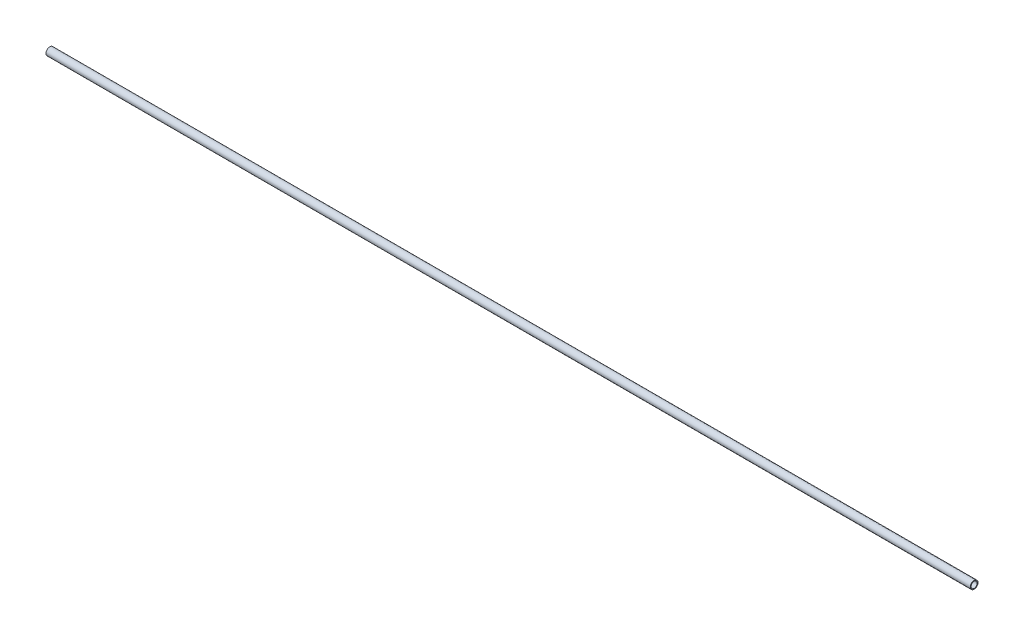
ISO-10303-21;
HEADER;
FILE_DESCRIPTION(('STEP AP214'),'2;1');
FILE_NAME('part.step','',(''),(''),'','','');
FILE_SCHEMA(('AUTOMOTIVE_DESIGN { 1 0 10303 214 1 1 1 1 }'));
ENDSEC;
DATA;
#1=APPLICATION_CONTEXT('core data for automotive mechanical design processes');
#2=APPLICATION_PROTOCOL_DEFINITION('international standard','automotive_design',2000,#1);
#3=PRODUCT_CONTEXT('',#1,'mechanical');
#4=PRODUCT('Part','Part','',(#3));
#5=PRODUCT_RELATED_PRODUCT_CATEGORY('part','',(#4));
#6=PRODUCT_DEFINITION_FORMATION('','',#4);
#7=PRODUCT_DEFINITION_CONTEXT('part definition',#1,'design');
#8=PRODUCT_DEFINITION('design','',#6,#7);
#9=PRODUCT_DEFINITION_SHAPE('','',#8);
#10=(LENGTH_UNIT() NAMED_UNIT(*) SI_UNIT(.MILLI.,.METRE.));
#11=(NAMED_UNIT(*) PLANE_ANGLE_UNIT() SI_UNIT($,.RADIAN.));
#12=(NAMED_UNIT(*) SI_UNIT($,.STERADIAN.) SOLID_ANGLE_UNIT());
#13=UNCERTAINTY_MEASURE_WITH_UNIT(LENGTH_MEASURE(1.E-05),#10,'distance_accuracy_value','');
#14=(GEOMETRIC_REPRESENTATION_CONTEXT(3) GLOBAL_UNCERTAINTY_ASSIGNED_CONTEXT((#13)) GLOBAL_UNIT_ASSIGNED_CONTEXT((#10,
#11,#12)) REPRESENTATION_CONTEXT('',''));
#15=CARTESIAN_POINT('',(0.,0.,0.));
#16=DIRECTION('',(0.,0.,1.));
#17=DIRECTION('',(1.,0.,0.));
#18=AXIS2_PLACEMENT_3D('',#15,#16,#17);
#19=CARTESIAN_POINT('',(1524.,0.,0.));
#20=DIRECTION('',(1.,0.,0.));
#21=DIRECTION('',(0.,0.,-1.));
#22=AXIS2_PLACEMENT_3D('',#19,#20,#21);
#23=PLANE('',#22);
#24=CARTESIAN_POINT('',(1524.,0.,0.));
#25=DIRECTION('',(1.,0.,0.));
#26=DIRECTION('',(0.,0.,-1.));
#27=AXIS2_PLACEMENT_3D('',#24,#25,#26);
#28=CIRCLE('',#27,6.35);
#29=CARTESIAN_POINT('',(1524.,0.,-6.35));
#30=VERTEX_POINT('',#29);
#31=EDGE_CURVE('E10',#30,#30,#28,.T.);
#32=ORIENTED_EDGE('',*,*,#31,.T.);
#33=EDGE_LOOP('',(#32));
#34=FACE_BOUND('',#33,.T.);
#35=CARTESIAN_POINT('',(1524.,0.,0.));
#36=DIRECTION('',(1.,0.,0.));
#37=DIRECTION('',(0.,0.,-1.));
#38=AXIS2_PLACEMENT_3D('',#35,#36,#37);
#39=CIRCLE('',#38,5.08);
#40=CARTESIAN_POINT('',(1524.,0.,-5.08));
#41=VERTEX_POINT('',#40);
#42=EDGE_CURVE('E45',#41,#41,#39,.T.);
#43=ORIENTED_EDGE('',*,*,#42,.F.);
#44=EDGE_LOOP('',(#43));
#45=FACE_BOUND('',#44,.T.);
#46=ADVANCED_FACE('F34',(#34,#45),#23,.T.);
#47=CARTESIAN_POINT('',(0.,0.,0.));
#48=DIRECTION('',(1.,0.,0.));
#49=DIRECTION('',(0.,0.,-1.));
#50=AXIS2_PLACEMENT_3D('',#47,#48,#49);
#51=PLANE('',#50);
#52=CARTESIAN_POINT('',(0.,0.,0.));
#53=DIRECTION('',(1.,0.,0.));
#54=DIRECTION('',(0.,0.,-1.));
#55=AXIS2_PLACEMENT_3D('',#52,#53,#54);
#56=CIRCLE('',#55,6.35);
#57=CARTESIAN_POINT('',(0.,0.,-6.35));
#58=VERTEX_POINT('',#57);
#59=EDGE_CURVE('E38',#58,#58,#56,.T.);
#60=ORIENTED_EDGE('',*,*,#59,.F.);
#61=EDGE_LOOP('',(#60));
#62=FACE_BOUND('',#61,.T.);
#63=CARTESIAN_POINT('',(0.,0.,0.));
#64=DIRECTION('',(1.,0.,0.));
#65=DIRECTION('',(0.,0.,-1.));
#66=AXIS2_PLACEMENT_3D('',#63,#64,#65);
#67=CIRCLE('',#66,5.08);
#68=CARTESIAN_POINT('',(0.,0.,-5.08));
#69=VERTEX_POINT('',#68);
#70=EDGE_CURVE('E47',#69,#69,#67,.T.);
#71=ORIENTED_EDGE('',*,*,#70,.T.);
#72=EDGE_LOOP('',(#71));
#73=FACE_BOUND('',#72,.T.);
#74=ADVANCED_FACE('F57',(#62,#73),#51,.F.);
#75=CARTESIAN_POINT('',(1524.,0.,0.));
#76=DIRECTION('',(-1.,0.,0.));
#77=DIRECTION('',(0.,0.,1.));
#78=AXIS2_PLACEMENT_3D('',#75,#76,#77);
#79=CYLINDRICAL_SURFACE('',#78,6.35);
#80=ORIENTED_EDGE('',*,*,#31,.F.);
#81=EDGE_LOOP('',(#80));
#82=FACE_BOUND('',#81,.T.);
#83=ORIENTED_EDGE('',*,*,#59,.T.);
#84=EDGE_LOOP('',(#83));
#85=FACE_BOUND('',#84,.T.);
#86=ADVANCED_FACE('F36',(#82,#85),#79,.T.);
#87=CARTESIAN_POINT('',(1524.,0.,0.));
#88=DIRECTION('',(-1.,0.,0.));
#89=DIRECTION('',(0.,0.,1.));
#90=AXIS2_PLACEMENT_3D('',#87,#88,#89);
#91=CYLINDRICAL_SURFACE('',#90,5.08);
#92=ORIENTED_EDGE('',*,*,#42,.T.);
#93=EDGE_LOOP('',(#92));
#94=FACE_BOUND('',#93,.T.);
#95=ORIENTED_EDGE('',*,*,#70,.F.);
#96=EDGE_LOOP('',(#95));
#97=FACE_BOUND('',#96,.T.);
#98=ADVANCED_FACE('F53',(#94,#97),#91,.F.);
#99=CLOSED_SHELL('',(#46,#74,#86,#98));
#100=MANIFOLD_SOLID_BREP('B2',#99);
#101=ADVANCED_BREP_SHAPE_REPRESENTATION('',(#18,#100),#14);
#102=SHAPE_DEFINITION_REPRESENTATION(#9,#101);
ENDSEC;
END-ISO-10303-21;
